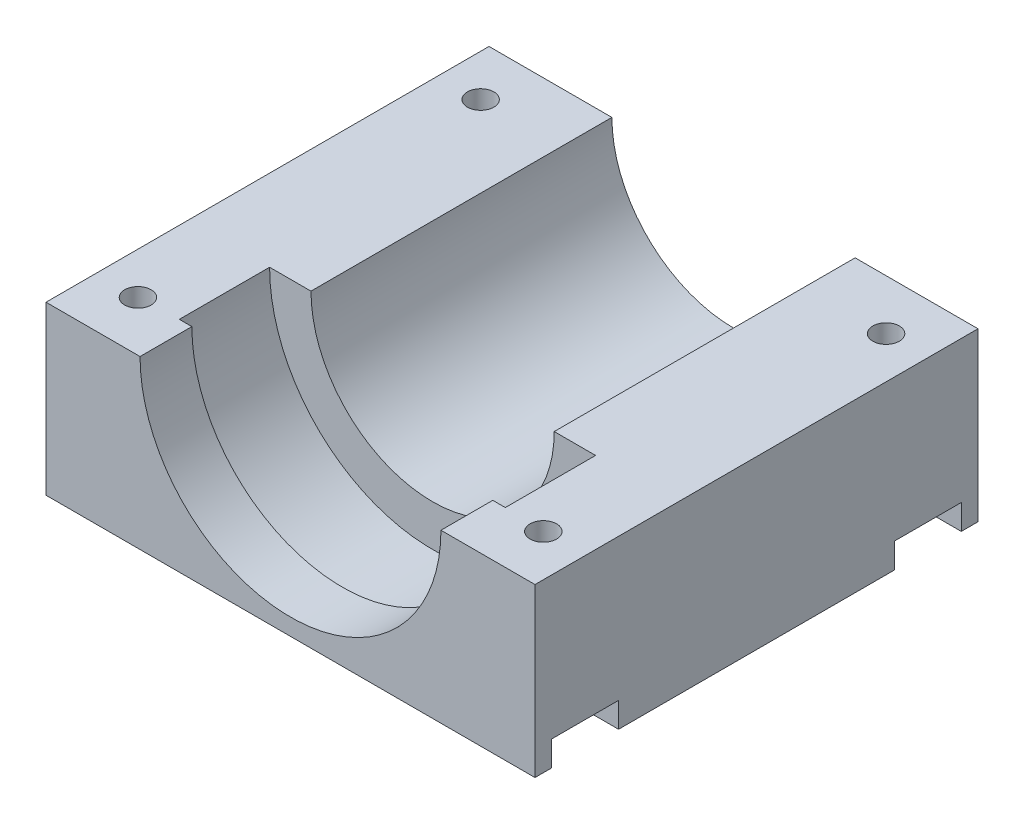
ISO-10303-21;
HEADER;
FILE_DESCRIPTION(('STEP AP214'),'2;1');
FILE_NAME('part.step','',(''),(''),'','','');
FILE_SCHEMA(('AUTOMOTIVE_DESIGN { 1 0 10303 214 1 1 1 1 }'));
ENDSEC;
DATA;
#1=APPLICATION_CONTEXT('core data for automotive mechanical design processes');
#2=APPLICATION_PROTOCOL_DEFINITION('international standard','automotive_design',2000,#1);
#3=PRODUCT_CONTEXT('',#1,'mechanical');
#4=PRODUCT('Part','Part','',(#3));
#5=PRODUCT_RELATED_PRODUCT_CATEGORY('part','',(#4));
#6=PRODUCT_DEFINITION_FORMATION('','',#4);
#7=PRODUCT_DEFINITION_CONTEXT('part definition',#1,'design');
#8=PRODUCT_DEFINITION('design','',#6,#7);
#9=PRODUCT_DEFINITION_SHAPE('','',#8);
#10=(LENGTH_UNIT() NAMED_UNIT(*) SI_UNIT(.MILLI.,.METRE.));
#11=(NAMED_UNIT(*) PLANE_ANGLE_UNIT() SI_UNIT($,.RADIAN.));
#12=(NAMED_UNIT(*) SI_UNIT($,.STERADIAN.) SOLID_ANGLE_UNIT());
#13=UNCERTAINTY_MEASURE_WITH_UNIT(LENGTH_MEASURE(1.E-05),#10,'distance_accuracy_value','');
#14=(GEOMETRIC_REPRESENTATION_CONTEXT(3) GLOBAL_UNCERTAINTY_ASSIGNED_CONTEXT((#13)) GLOBAL_UNIT_ASSIGNED_CONTEXT((#10,
#11,#12)) REPRESENTATION_CONTEXT('',''));
#15=CARTESIAN_POINT('',(0.,0.,0.));
#16=DIRECTION('',(0.,0.,1.));
#17=DIRECTION('',(1.,0.,0.));
#18=AXIS2_PLACEMENT_3D('',#15,#16,#17);
#19=CARTESIAN_POINT('',(4.99999999999999,78.8908045977011,47.));
#20=DIRECTION('',(0.,-1.,0.));
#21=DIRECTION('',(1.,0.,0.));
#22=AXIS2_PLACEMENT_3D('',#19,#20,#21);
#23=CYLINDRICAL_SURFACE('',#22,1.585);
#24=CARTESIAN_POINT('',(5.,6.39080459770115,47.));
#25=DIRECTION('',(0.,-1.,0.));
#26=DIRECTION('',(0.,0.,-1.));
#27=AXIS2_PLACEMENT_3D('',#24,#25,#26);
#28=CIRCLE('',#27,1.585);
#29=CARTESIAN_POINT('',(5.,6.39080459770115,45.415));
#30=VERTEX_POINT('',#29);
#31=EDGE_CURVE('E340',#30,#30,#28,.T.);
#32=ORIENTED_EDGE('',*,*,#31,.F.);
#33=EDGE_LOOP('',(#32));
#34=FACE_BOUND('',#33,.T.);
#35=CARTESIAN_POINT('',(5.,-10.6091954022988,47.));
#36=DIRECTION('',(0.,-1.,0.));
#37=DIRECTION('',(1.,0.,0.));
#38=AXIS2_PLACEMENT_3D('',#35,#36,#37);
#39=CIRCLE('',#38,1.585);
#40=CARTESIAN_POINT('',(6.585,-10.6091954022988,47.));
#41=VERTEX_POINT('',#40);
#42=EDGE_CURVE('E272',#41,#41,#39,.F.);
#43=ORIENTED_EDGE('',*,*,#42,.F.);
#44=EDGE_LOOP('',(#43));
#45=FACE_BOUND('',#44,.T.);
#46=ADVANCED_FACE('F49',(#34,#45),#23,.F.);
#47=CARTESIAN_POINT('',(0.,-13.6091954022989,53.));
#48=DIRECTION('',(0.,1.,0.));
#49=DIRECTION('',(-1.,0.,0.));
#50=AXIS2_PLACEMENT_3D('',#47,#48,#49);
#51=PLANE('',#50);
#52=DIRECTION('',(0.,0.,-1.));
#53=VECTOR('',#52,1.);
#54=CARTESIAN_POINT('',(0.,-13.6091954022989,53.));
#55=LINE('',#54,#53);
#56=CARTESIAN_POINT('',(0.,-13.6091954022989,53.));
#57=VERTEX_POINT('',#56);
#58=CARTESIAN_POINT('',(0.,-13.6091954022988,51.));
#59=VERTEX_POINT('',#58);
#60=EDGE_CURVE('E423',#57,#59,#55,.T.);
#61=ORIENTED_EDGE('',*,*,#60,.T.);
#62=DIRECTION('',(-1.,0.,0.));
#63=VECTOR('',#62,1.);
#64=CARTESIAN_POINT('',(0.,-13.6091954022988,51.));
#65=LINE('',#64,#63);
#66=CARTESIAN_POINT('',(10.,-13.6091954022988,51.));
#67=VERTEX_POINT('',#66);
#68=EDGE_CURVE('E259',#67,#59,#65,.T.);
#69=ORIENTED_EDGE('',*,*,#68,.F.);
#70=DIRECTION('',(0.,0.,1.));
#71=VECTOR('',#70,1.);
#72=CARTESIAN_POINT('',(10.,-13.6091954022988,51.));
#73=LINE('',#72,#71);
#74=CARTESIAN_POINT('',(10.,-13.6091954022988,43.));
#75=VERTEX_POINT('',#74);
#76=EDGE_CURVE('E251',#75,#67,#73,.T.);
#77=ORIENTED_EDGE('',*,*,#76,.F.);
#78=DIRECTION('',(1.,0.,0.));
#79=VECTOR('',#78,1.);
#80=CARTESIAN_POINT('',(0.,-13.6091954022988,43.));
#81=LINE('',#80,#79);
#82=CARTESIAN_POINT('',(0.,-13.6091954022988,43.));
#83=VERTEX_POINT('',#82);
#84=EDGE_CURVE('E248',#83,#75,#81,.T.);
#85=ORIENTED_EDGE('',*,*,#84,.F.);
#86=CARTESIAN_POINT('',(0.,-13.6091954022988,10.));
#87=VERTEX_POINT('',#86);
#88=EDGE_CURVE('E426',#83,#87,#55,.T.);
#89=ORIENTED_EDGE('',*,*,#88,.T.);
#90=DIRECTION('',(1.,0.,0.));
#91=VECTOR('',#90,1.);
#92=CARTESIAN_POINT('',(0.,-13.6091954022988,10.));
#93=LINE('',#92,#91);
#94=CARTESIAN_POINT('',(10.,-13.6091954022988,10.));
#95=VERTEX_POINT('',#94);
#96=EDGE_CURVE('E308',#87,#95,#93,.T.);
#97=ORIENTED_EDGE('',*,*,#96,.T.);
#98=DIRECTION('',(0.,0.,-1.));
#99=VECTOR('',#98,1.);
#100=CARTESIAN_POINT('',(10.,-13.6091954022988,2.));
#101=LINE('',#100,#99);
#102=CARTESIAN_POINT('',(10.,-13.6091954022988,2.));
#103=VERTEX_POINT('',#102);
#104=EDGE_CURVE('E318',#95,#103,#101,.T.);
#105=ORIENTED_EDGE('',*,*,#104,.T.);
#106=DIRECTION('',(-1.,0.,0.));
#107=VECTOR('',#106,1.);
#108=CARTESIAN_POINT('',(0.,-13.6091954022988,2.));
#109=LINE('',#108,#107);
#110=CARTESIAN_POINT('',(0.,-13.6091954022989,2.));
#111=VERTEX_POINT('',#110);
#112=EDGE_CURVE('E315',#103,#111,#109,.T.);
#113=ORIENTED_EDGE('',*,*,#112,.T.);
#114=CARTESIAN_POINT('',(0.,-13.6091954022989,0.));
#115=VERTEX_POINT('',#114);
#116=EDGE_CURVE('E421',#111,#115,#55,.T.);
#117=ORIENTED_EDGE('',*,*,#116,.T.);
#118=DIRECTION('',(1.,0.,0.));
#119=VECTOR('',#118,1.);
#120=CARTESIAN_POINT('',(0.,-13.6091954022989,0.));
#121=LINE('',#120,#119);
#122=CARTESIAN_POINT('',(58.5,-13.6091954022988,0.));
#123=VERTEX_POINT('',#122);
#124=EDGE_CURVE('E404',#115,#123,#121,.T.);
#125=ORIENTED_EDGE('',*,*,#124,.T.);
#126=DIRECTION('',(0.,0.,-1.));
#127=VECTOR('',#126,1.);
#128=CARTESIAN_POINT('',(58.5,-13.6091954022988,53.));
#129=LINE('',#128,#127);
#130=CARTESIAN_POINT('',(58.5,-13.6091954022988,2.));
#131=VERTEX_POINT('',#130);
#132=EDGE_CURVE('E417',#131,#123,#129,.T.);
#133=ORIENTED_EDGE('',*,*,#132,.F.);
#134=DIRECTION('',(1.,0.,0.));
#135=VECTOR('',#134,1.);
#136=CARTESIAN_POINT('',(58.5,-13.6091954022988,2.));
#137=LINE('',#136,#135);
#138=CARTESIAN_POINT('',(48.5,-13.6091954022988,2.));
#139=VERTEX_POINT('',#138);
#140=EDGE_CURVE('E348',#139,#131,#137,.T.);
#141=ORIENTED_EDGE('',*,*,#140,.F.);
#142=DIRECTION('',(0.,0.,-1.));
#143=VECTOR('',#142,1.);
#144=CARTESIAN_POINT('',(48.5,-13.6091954022988,2.));
#145=LINE('',#144,#143);
#146=CARTESIAN_POINT('',(48.5,-13.6091954022988,10.));
#147=VERTEX_POINT('',#146);
#148=EDGE_CURVE('E359',#147,#139,#145,.T.);
#149=ORIENTED_EDGE('',*,*,#148,.F.);
#150=DIRECTION('',(-1.,0.,0.));
#151=VECTOR('',#150,1.);
#152=CARTESIAN_POINT('',(58.5,-13.6091954022988,10.));
#153=LINE('',#152,#151);
#154=CARTESIAN_POINT('',(58.5,-13.6091954022988,10.));
#155=VERTEX_POINT('',#154);
#156=EDGE_CURVE('E343',#155,#147,#153,.T.);
#157=ORIENTED_EDGE('',*,*,#156,.F.);
#158=CARTESIAN_POINT('',(58.5,-13.6091954022988,43.));
#159=VERTEX_POINT('',#158);
#160=EDGE_CURVE('E422',#159,#155,#129,.T.);
#161=ORIENTED_EDGE('',*,*,#160,.F.);
#162=DIRECTION('',(-1.,0.,0.));
#163=VECTOR('',#162,1.);
#164=CARTESIAN_POINT('',(58.5,-13.6091954022988,43.));
#165=LINE('',#164,#163);
#166=CARTESIAN_POINT('',(48.5,-13.6091954022988,43.));
#167=VERTEX_POINT('',#166);
#168=EDGE_CURVE('E282',#159,#167,#165,.T.);
#169=ORIENTED_EDGE('',*,*,#168,.T.);
#170=DIRECTION('',(0.,0.,1.));
#171=VECTOR('',#170,1.);
#172=CARTESIAN_POINT('',(48.5,-13.6091954022988,51.));
#173=LINE('',#172,#171);
#174=CARTESIAN_POINT('',(48.5,-13.6091954022988,51.));
#175=VERTEX_POINT('',#174);
#176=EDGE_CURVE('E292',#167,#175,#173,.T.);
#177=ORIENTED_EDGE('',*,*,#176,.T.);
#178=DIRECTION('',(1.,0.,0.));
#179=VECTOR('',#178,1.);
#180=CARTESIAN_POINT('',(58.5,-13.6091954022988,51.));
#181=LINE('',#180,#179);
#182=CARTESIAN_POINT('',(58.5,-13.6091954022988,51.));
#183=VERTEX_POINT('',#182);
#184=EDGE_CURVE('E289',#175,#183,#181,.T.);
#185=ORIENTED_EDGE('',*,*,#184,.T.);
#186=CARTESIAN_POINT('',(58.5,-13.6091954022988,53.));
#187=VERTEX_POINT('',#186);
#188=EDGE_CURVE('E418',#187,#183,#129,.T.);
#189=ORIENTED_EDGE('',*,*,#188,.F.);
#190=DIRECTION('',(1.,0.,0.));
#191=VECTOR('',#190,1.);
#192=CARTESIAN_POINT('',(0.,-13.6091954022989,53.));
#193=LINE('',#192,#191);
#194=EDGE_CURVE('E392',#57,#187,#193,.T.);
#195=ORIENTED_EDGE('',*,*,#194,.F.);
#196=EDGE_LOOP('',(#61,#69,#77,#85,#89,#97,#105,#113,#117,#125,#133,#141,#149,#157,#161,#169,
#177,#185,#189,#195));
#197=FACE_BOUND('',#196,.T.);
#198=ADVANCED_FACE('F441',(#197),#51,.F.);
#199=CARTESIAN_POINT('',(58.5,-13.6091954022988,53.));
#200=DIRECTION('',(-1.,0.,0.));
#201=DIRECTION('',(0.,0.,1.));
#202=AXIS2_PLACEMENT_3D('',#199,#200,#201);
#203=PLANE('',#202);
#204=DIRECTION('',(0.,-1.,0.));
#205=VECTOR('',#204,1.);
#206=CARTESIAN_POINT('',(58.5,-10.6091954022988,43.));
#207=LINE('',#206,#205);
#208=CARTESIAN_POINT('',(58.5,-10.6091954022988,43.));
#209=VERTEX_POINT('',#208);
#210=EDGE_CURVE('E72',#209,#159,#207,.T.);
#211=ORIENTED_EDGE('',*,*,#210,.T.);
#212=ORIENTED_EDGE('',*,*,#160,.T.);
#213=DIRECTION('',(0.,-1.,0.));
#214=VECTOR('',#213,1.);
#215=CARTESIAN_POINT('',(58.5,-10.6091954022988,10.));
#216=LINE('',#215,#214);
#217=CARTESIAN_POINT('',(58.5,-10.6091954022988,10.));
#218=VERTEX_POINT('',#217);
#219=EDGE_CURVE('E356',#218,#155,#216,.T.);
#220=ORIENTED_EDGE('',*,*,#219,.F.);
#221=DIRECTION('',(0.,0.,1.));
#222=VECTOR('',#221,1.);
#223=CARTESIAN_POINT('',(58.5,-10.6091954022988,2.));
#224=LINE('',#223,#222);
#225=CARTESIAN_POINT('',(58.5,-10.6091954022988,2.));
#226=VERTEX_POINT('',#225);
#227=EDGE_CURVE('E344',#226,#218,#224,.T.);
#228=ORIENTED_EDGE('',*,*,#227,.F.);
#229=DIRECTION('',(0.,-1.,0.));
#230=VECTOR('',#229,1.);
#231=CARTESIAN_POINT('',(58.5,-10.6091954022988,2.));
#232=LINE('',#231,#230);
#233=EDGE_CURVE('E363',#226,#131,#232,.T.);
#234=ORIENTED_EDGE('',*,*,#233,.T.);
#235=ORIENTED_EDGE('',*,*,#132,.T.);
#236=DIRECTION('',(0.,1.,0.));
#237=VECTOR('',#236,1.);
#238=CARTESIAN_POINT('',(58.5,-13.6091954022988,0.));
#239=LINE('',#238,#237);
#240=CARTESIAN_POINT('',(58.5,6.39080459770115,0.));
#241=VERTEX_POINT('',#240);
#242=EDGE_CURVE('E407',#123,#241,#239,.T.);
#243=ORIENTED_EDGE('',*,*,#242,.T.);
#244=DIRECTION('',(0.,0.,-1.));
#245=VECTOR('',#244,1.);
#246=CARTESIAN_POINT('',(58.5,6.39080459770115,53.));
#247=LINE('',#246,#245);
#248=CARTESIAN_POINT('',(58.5,6.39080459770115,53.));
#249=VERTEX_POINT('',#248);
#250=EDGE_CURVE('E414',#249,#241,#247,.T.);
#251=ORIENTED_EDGE('',*,*,#250,.F.);
#252=DIRECTION('',(0.,1.,0.));
#253=VECTOR('',#252,1.);
#254=CARTESIAN_POINT('',(58.5,-13.6091954022988,53.));
#255=LINE('',#254,#253);
#256=EDGE_CURVE('E395',#187,#249,#255,.T.);
#257=ORIENTED_EDGE('',*,*,#256,.F.);
#258=ORIENTED_EDGE('',*,*,#188,.T.);
#259=DIRECTION('',(0.,-1.,0.));
#260=VECTOR('',#259,1.);
#261=CARTESIAN_POINT('',(58.5,-10.6091954022988,51.));
#262=LINE('',#261,#260);
#263=CARTESIAN_POINT('',(58.5,-10.6091954022988,51.));
#264=VERTEX_POINT('',#263);
#265=EDGE_CURVE('E288',#264,#183,#262,.T.);
#266=ORIENTED_EDGE('',*,*,#265,.F.);
#267=DIRECTION('',(0.,0.,-1.));
#268=VECTOR('',#267,1.);
#269=CARTESIAN_POINT('',(58.5,-10.6091954022988,51.));
#270=LINE('',#269,#268);
#271=EDGE_CURVE('E278',#264,#209,#270,.T.);
#272=ORIENTED_EDGE('',*,*,#271,.T.);
#273=EDGE_LOOP('',(#211,#212,#220,#228,#234,#235,#243,#251,#257,#258,#266,#272));
#274=FACE_BOUND('',#273,.T.);
#275=ADVANCED_FACE('F447',(#274),#203,.F.);
#276=CARTESIAN_POINT('',(53.5,78.8908045977011,47.));
#277=DIRECTION('',(0.,-1.,0.));
#278=DIRECTION('',(1.,0.,0.));
#279=AXIS2_PLACEMENT_3D('',#276,#277,#278);
#280=CYLINDRICAL_SURFACE('',#279,1.585);
#281=CARTESIAN_POINT('',(53.5,6.39080459770115,47.));
#282=DIRECTION('',(0.,-1.,0.));
#283=DIRECTION('',(0.,0.,-1.));
#284=AXIS2_PLACEMENT_3D('',#281,#282,#283);
#285=CIRCLE('',#284,1.585);
#286=CARTESIAN_POINT('',(53.5,6.39080459770115,45.415));
#287=VERTEX_POINT('',#286);
#288=EDGE_CURVE('E335',#287,#287,#285,.T.);
#289=ORIENTED_EDGE('',*,*,#288,.F.);
#290=EDGE_LOOP('',(#289));
#291=FACE_BOUND('',#290,.T.);
#292=CARTESIAN_POINT('',(53.5,-10.6091954022988,47.));
#293=DIRECTION('',(0.,-1.,0.));
#294=DIRECTION('',(1.,0.,0.));
#295=AXIS2_PLACEMENT_3D('',#292,#293,#294);
#296=CIRCLE('',#295,1.585);
#297=CARTESIAN_POINT('',(55.085,-10.6091954022988,47.));
#298=VERTEX_POINT('',#297);
#299=EDGE_CURVE('E298',#298,#298,#296,.F.);
#300=ORIENTED_EDGE('',*,*,#299,.F.);
#301=EDGE_LOOP('',(#300));
#302=FACE_BOUND('',#301,.T.);
#303=ADVANCED_FACE('F454',(#291,#302),#280,.F.);
#304=CARTESIAN_POINT('',(0.,-13.6091954022989,53.));
#305=DIRECTION('',(1.,0.,0.));
#306=DIRECTION('',(0.,0.,-1.));
#307=AXIS2_PLACEMENT_3D('',#304,#305,#306);
#308=PLANE('',#307);
#309=DIRECTION('',(0.,0.,-1.));
#310=VECTOR('',#309,1.);
#311=CARTESIAN_POINT('',(0.,-10.6091954022988,51.));
#312=LINE('',#311,#310);
#313=CARTESIAN_POINT('',(0.,-10.6091954022988,51.));
#314=VERTEX_POINT('',#313);
#315=CARTESIAN_POINT('',(0.,-10.6091954022988,43.));
#316=VERTEX_POINT('',#315);
#317=EDGE_CURVE('E256',#314,#316,#312,.T.);
#318=ORIENTED_EDGE('',*,*,#317,.F.);
#319=DIRECTION('',(0.,-1.,0.));
#320=VECTOR('',#319,1.);
#321=CARTESIAN_POINT('',(0.,-10.6091954022988,51.));
#322=LINE('',#321,#320);
#323=EDGE_CURVE('E269',#314,#59,#322,.T.);
#324=ORIENTED_EDGE('',*,*,#323,.T.);
#325=ORIENTED_EDGE('',*,*,#60,.F.);
#326=DIRECTION('',(0.,-1.,0.));
#327=VECTOR('',#326,1.);
#328=CARTESIAN_POINT('',(0.,-13.6091954022989,53.));
#329=LINE('',#328,#327);
#330=CARTESIAN_POINT('',(0.,6.39080459770115,53.));
#331=VERTEX_POINT('',#330);
#332=EDGE_CURVE('E389',#331,#57,#329,.T.);
#333=ORIENTED_EDGE('',*,*,#332,.F.);
#334=DIRECTION('',(0.,0.,-1.));
#335=VECTOR('',#334,1.);
#336=CARTESIAN_POINT('',(0.,6.39080459770115,53.));
#337=LINE('',#336,#335);
#338=CARTESIAN_POINT('',(0.,6.39080459770115,0.));
#339=VERTEX_POINT('',#338);
#340=EDGE_CURVE('E401',#331,#339,#337,.T.);
#341=ORIENTED_EDGE('',*,*,#340,.T.);
#342=DIRECTION('',(0.,-1.,0.));
#343=VECTOR('',#342,1.);
#344=CARTESIAN_POINT('',(0.,-13.6091954022989,0.));
#345=LINE('',#344,#343);
#346=EDGE_CURVE('E387',#339,#115,#345,.T.);
#347=ORIENTED_EDGE('',*,*,#346,.T.);
#348=ORIENTED_EDGE('',*,*,#116,.F.);
#349=DIRECTION('',(0.,-1.,0.));
#350=VECTOR('',#349,1.);
#351=CARTESIAN_POINT('',(0.,-10.6091954022988,2.));
#352=LINE('',#351,#350);
#353=CARTESIAN_POINT('',(0.,-10.6091954022988,2.));
#354=VERTEX_POINT('',#353);
#355=EDGE_CURVE('E314',#354,#111,#352,.T.);
#356=ORIENTED_EDGE('',*,*,#355,.F.);
#357=DIRECTION('',(0.,0.,1.));
#358=VECTOR('',#357,1.);
#359=CARTESIAN_POINT('',(0.,-10.6091954022988,2.));
#360=LINE('',#359,#358);
#361=CARTESIAN_POINT('',(0.,-10.6091954022988,10.));
#362=VERTEX_POINT('',#361);
#363=EDGE_CURVE('E304',#354,#362,#360,.T.);
#364=ORIENTED_EDGE('',*,*,#363,.T.);
#365=DIRECTION('',(0.,-1.,0.));
#366=VECTOR('',#365,1.);
#367=CARTESIAN_POINT('',(0.,-10.6091954022988,10.));
#368=LINE('',#367,#366);
#369=EDGE_CURVE('E323',#362,#87,#368,.T.);
#370=ORIENTED_EDGE('',*,*,#369,.T.);
#371=ORIENTED_EDGE('',*,*,#88,.F.);
#372=DIRECTION('',(0.,-1.,0.));
#373=VECTOR('',#372,1.);
#374=CARTESIAN_POINT('',(0.,-10.6091954022988,43.));
#375=LINE('',#374,#373);
#376=EDGE_CURVE('E264',#316,#83,#375,.T.);
#377=ORIENTED_EDGE('',*,*,#376,.F.);
#378=EDGE_LOOP('',(#318,#324,#325,#333,#341,#347,#348,#356,#364,#370,#371,#377));
#379=FACE_BOUND('',#378,.T.);
#380=ADVANCED_FACE('F51',(#379),#308,.F.);
#381=CARTESIAN_POINT('',(4.99999999999999,78.8908045977011,6.00000000000001));
#382=DIRECTION('',(0.,-1.,0.));
#383=DIRECTION('',(1.,0.,0.));
#384=AXIS2_PLACEMENT_3D('',#381,#382,#383);
#385=CYLINDRICAL_SURFACE('',#384,1.585);
#386=CARTESIAN_POINT('',(5.,6.39080459770115,6.00000000000001));
#387=DIRECTION('',(0.,-1.,0.));
#388=DIRECTION('',(0.,0.,-1.));
#389=AXIS2_PLACEMENT_3D('',#386,#387,#388);
#390=CIRCLE('',#389,1.585);
#391=CARTESIAN_POINT('',(5.,6.39080459770115,4.41500000000001));
#392=VERTEX_POINT('',#391);
#393=EDGE_CURVE('E337',#392,#392,#390,.T.);
#394=ORIENTED_EDGE('',*,*,#393,.F.);
#395=EDGE_LOOP('',(#394));
#396=FACE_BOUND('',#395,.T.);
#397=CARTESIAN_POINT('',(5.,-10.6091954022988,6.00000000000001));
#398=DIRECTION('',(0.,-1.,0.));
#399=DIRECTION('',(1.,0.,0.));
#400=AXIS2_PLACEMENT_3D('',#397,#398,#399);
#401=CIRCLE('',#400,1.585);
#402=CARTESIAN_POINT('',(6.585,-10.6091954022988,6.00000000000001));
#403=VERTEX_POINT('',#402);
#404=EDGE_CURVE('E326',#403,#403,#401,.F.);
#405=ORIENTED_EDGE('',*,*,#404,.F.);
#406=EDGE_LOOP('',(#405));
#407=FACE_BOUND('',#406,.T.);
#408=ADVANCED_FACE('F452',(#396,#407),#385,.F.);
#409=CARTESIAN_POINT('',(0.,6.39080459770115,53.));
#410=DIRECTION('',(0.,-1.,0.));
#411=DIRECTION('',(0.,0.,-1.));
#412=AXIS2_PLACEMENT_3D('',#409,#410,#411);
#413=PLANE('',#412);
#414=ORIENTED_EDGE('',*,*,#31,.T.);
#415=EDGE_LOOP('',(#414));
#416=FACE_BOUND('',#415,.T.);
#417=ORIENTED_EDGE('',*,*,#393,.T.);
#418=EDGE_LOOP('',(#417));
#419=FACE_BOUND('',#418,.T.);
#420=DIRECTION('',(0.,0.,1.));
#421=VECTOR('',#420,1.);
#422=CARTESIAN_POINT('',(11.25,6.39080459770115,36.));
#423=LINE('',#422,#421);
#424=CARTESIAN_POINT('',(11.25,6.39080459770115,46.8));
#425=VERTEX_POINT('',#424);
#426=CARTESIAN_POINT('',(11.25,6.39080459770115,53.));
#427=VERTEX_POINT('',#426);
#428=EDGE_CURVE('E385',#425,#427,#423,.T.);
#429=ORIENTED_EDGE('',*,*,#428,.F.);
#430=DIRECTION('',(-1.,0.,0.));
#431=VECTOR('',#430,1.);
#432=CARTESIAN_POINT('',(9.75,6.39080459770115,46.8));
#433=LINE('',#432,#431);
#434=CARTESIAN_POINT('',(9.75,6.39080459770115,46.8));
#435=VERTEX_POINT('',#434);
#436=EDGE_CURVE('E233',#425,#435,#433,.T.);
#437=ORIENTED_EDGE('',*,*,#436,.T.);
#438=DIRECTION('',(0.,0.,-1.));
#439=VECTOR('',#438,1.);
#440=CARTESIAN_POINT('',(9.75,6.39080459770115,46.8));
#441=LINE('',#440,#439);
#442=CARTESIAN_POINT('',(9.75,6.39080459770115,36.));
#443=VERTEX_POINT('',#442);
#444=EDGE_CURVE('E232',#435,#443,#441,.T.);
#445=ORIENTED_EDGE('',*,*,#444,.T.);
#446=DIRECTION('',(-1.,0.,0.));
#447=VECTOR('',#446,1.);
#448=CARTESIAN_POINT('',(11.25,6.39080459770115,36.));
#449=LINE('',#448,#447);
#450=CARTESIAN_POINT('',(14.7,6.39080459770115,36.));
#451=VERTEX_POINT('',#450);
#452=EDGE_CURVE('E382',#451,#443,#449,.T.);
#453=ORIENTED_EDGE('',*,*,#452,.F.);
#454=DIRECTION('',(0.,0.,-1.));
#455=VECTOR('',#454,1.);
#456=CARTESIAN_POINT('',(14.7,6.39080459770115,42.5));
#457=LINE('',#456,#455);
#458=CARTESIAN_POINT('',(14.7,6.39080459770115,0.));
#459=VERTEX_POINT('',#458);
#460=EDGE_CURVE('E374',#451,#459,#457,.T.);
#461=ORIENTED_EDGE('',*,*,#460,.T.);
#462=DIRECTION('',(-1.,0.,0.));
#463=VECTOR('',#462,1.);
#464=CARTESIAN_POINT('',(0.,6.39080459770115,0.));
#465=LINE('',#464,#463);
#466=EDGE_CURVE('E409',#459,#339,#465,.T.);
#467=ORIENTED_EDGE('',*,*,#466,.T.);
#468=ORIENTED_EDGE('',*,*,#340,.F.);
#469=DIRECTION('',(-1.,0.,0.));
#470=VECTOR('',#469,1.);
#471=CARTESIAN_POINT('',(0.,6.39080459770115,53.));
#472=LINE('',#471,#470);
#473=EDGE_CURVE('E397',#427,#331,#472,.T.);
#474=ORIENTED_EDGE('',*,*,#473,.F.);
#475=EDGE_LOOP('',(#429,#437,#445,#453,#461,#467,#468,#474));
#476=FACE_BOUND('',#475,.T.);
#477=ADVANCED_FACE('F497',(#416,#419,#476),#413,.F.);
#478=CARTESIAN_POINT('',(53.5,6.39080459770115,6.));
#479=DIRECTION('',(0.,-1.,0.));
#480=DIRECTION('',(0.,0.,-1.));
#481=AXIS2_PLACEMENT_3D('',#478,#479,#480);
#482=CIRCLE('',#481,1.585);
#483=CARTESIAN_POINT('',(53.5,6.39080459770115,4.415));
#484=VERTEX_POINT('',#483);
#485=EDGE_CURVE('E332',#484,#484,#482,.T.);
#486=ORIENTED_EDGE('',*,*,#485,.T.);
#487=EDGE_LOOP('',(#486));
#488=FACE_BOUND('',#487,.T.);
#489=ORIENTED_EDGE('',*,*,#288,.T.);
#490=EDGE_LOOP('',(#489));
#491=FACE_BOUND('',#490,.T.);
#492=DIRECTION('',(0.,0.,-1.));
#493=VECTOR('',#492,1.);
#494=CARTESIAN_POINT('',(48.75,6.39080459770115,46.8));
#495=LINE('',#494,#493);
#496=CARTESIAN_POINT('',(48.75,6.39080459770115,46.8));
#497=VERTEX_POINT('',#496);
#498=CARTESIAN_POINT('',(48.75,6.39080459770115,36.));
#499=VERTEX_POINT('',#498);
#500=EDGE_CURVE('E239',#497,#499,#495,.T.);
#501=ORIENTED_EDGE('',*,*,#500,.F.);
#502=CARTESIAN_POINT('',(47.25,6.39080459770115,46.8));
#503=VERTEX_POINT('',#502);
#504=EDGE_CURVE('E224',#497,#503,#433,.T.);
#505=ORIENTED_EDGE('',*,*,#504,.T.);
#506=DIRECTION('',(0.,0.,1.));
#507=VECTOR('',#506,1.);
#508=CARTESIAN_POINT('',(47.25,6.39080459770115,36.));
#509=LINE('',#508,#507);
#510=CARTESIAN_POINT('',(47.25,6.39080459770115,53.));
#511=VERTEX_POINT('',#510);
#512=EDGE_CURVE('E381',#503,#511,#509,.T.);
#513=ORIENTED_EDGE('',*,*,#512,.T.);
#514=EDGE_CURVE('E398',#249,#511,#472,.T.);
#515=ORIENTED_EDGE('',*,*,#514,.F.);
#516=ORIENTED_EDGE('',*,*,#250,.T.);
#517=CARTESIAN_POINT('',(43.8,6.39080459770115,0.));
#518=VERTEX_POINT('',#517);
#519=EDGE_CURVE('E393',#241,#518,#465,.T.);
#520=ORIENTED_EDGE('',*,*,#519,.T.);
#521=DIRECTION('',(0.,0.,-1.));
#522=VECTOR('',#521,1.);
#523=CARTESIAN_POINT('',(43.8,6.39080459770115,42.5));
#524=LINE('',#523,#522);
#525=CARTESIAN_POINT('',(43.8,6.39080459770115,36.));
#526=VERTEX_POINT('',#525);
#527=EDGE_CURVE('E375',#526,#518,#524,.T.);
#528=ORIENTED_EDGE('',*,*,#527,.F.);
#529=EDGE_CURVE('E247',#499,#526,#449,.T.);
#530=ORIENTED_EDGE('',*,*,#529,.F.);
#531=EDGE_LOOP('',(#501,#505,#513,#515,#516,#520,#528,#530));
#532=FACE_BOUND('',#531,.T.);
#533=ADVANCED_FACE('F244',(#488,#491,#532),#413,.F.);
#534=CARTESIAN_POINT('',(0.,0.,53.));
#535=DIRECTION('',(0.,0.,-1.));
#536=DIRECTION('',(-1.,0.,0.));
#537=AXIS2_PLACEMENT_3D('',#534,#535,#536);
#538=PLANE('',#537);
#539=ORIENTED_EDGE('',*,*,#514,.T.);
#540=CARTESIAN_POINT('',(29.25,6.39080459770116,53.));
#541=DIRECTION('',(0.,0.,1.));
#542=DIRECTION('',(1.,0.,0.));
#543=AXIS2_PLACEMENT_3D('',#540,#541,#542);
#544=CIRCLE('',#543,18.);
#545=EDGE_CURVE('E377',#427,#511,#544,.T.);
#546=ORIENTED_EDGE('',*,*,#545,.F.);
#547=ORIENTED_EDGE('',*,*,#473,.T.);
#548=ORIENTED_EDGE('',*,*,#332,.T.);
#549=ORIENTED_EDGE('',*,*,#194,.T.);
#550=ORIENTED_EDGE('',*,*,#256,.T.);
#551=EDGE_LOOP('',(#539,#546,#547,#548,#549,#550));
#552=FACE_BOUND('',#551,.T.);
#553=ADVANCED_FACE('F488',(#552),#538,.F.);
#554=CARTESIAN_POINT('',(0.,0.,0.));
#555=DIRECTION('',(0.,0.,-1.));
#556=DIRECTION('',(-1.,0.,0.));
#557=AXIS2_PLACEMENT_3D('',#554,#555,#556);
#558=PLANE('',#557);
#559=CARTESIAN_POINT('',(29.25,6.39080459770116,0.));
#560=DIRECTION('',(0.,0.,-1.));
#561=DIRECTION('',(-1.,0.,0.));
#562=AXIS2_PLACEMENT_3D('',#559,#560,#561);
#563=CIRCLE('',#562,14.55);
#564=EDGE_CURVE('E366',#518,#459,#563,.T.);
#565=ORIENTED_EDGE('',*,*,#564,.F.);
#566=ORIENTED_EDGE('',*,*,#519,.F.);
#567=ORIENTED_EDGE('',*,*,#242,.F.);
#568=ORIENTED_EDGE('',*,*,#124,.F.);
#569=ORIENTED_EDGE('',*,*,#346,.F.);
#570=ORIENTED_EDGE('',*,*,#466,.F.);
#571=EDGE_LOOP('',(#565,#566,#567,#568,#569,#570));
#572=FACE_BOUND('',#571,.T.);
#573=ADVANCED_FACE('F486',(#572),#558,.T.);
#574=CARTESIAN_POINT('',(29.25,6.39080459770116,36.));
#575=DIRECTION('',(0.,0.,1.));
#576=DIRECTION('',(1.,0.,0.));
#577=AXIS2_PLACEMENT_3D('',#574,#575,#576);
#578=CYLINDRICAL_SURFACE('',#577,18.);
#579=ORIENTED_EDGE('',*,*,#512,.F.);
#580=CARTESIAN_POINT('',(29.25,6.39080459770116,46.8));
#581=DIRECTION('',(0.,0.,1.));
#582=DIRECTION('',(1.,0.,0.));
#583=AXIS2_PLACEMENT_3D('',#580,#581,#582);
#584=CIRCLE('',#583,18.);
#585=EDGE_CURVE('E13',#503,#425,#584,.F.);
#586=ORIENTED_EDGE('',*,*,#585,.T.);
#587=ORIENTED_EDGE('',*,*,#428,.T.);
#588=ORIENTED_EDGE('',*,*,#545,.T.);
#589=EDGE_LOOP('',(#579,#586,#587,#588));
#590=FACE_BOUND('',#589,.T.);
#591=ADVANCED_FACE('F482',(#590),#578,.F.);
#592=CARTESIAN_POINT('',(29.25,6.39080459770116,36.));
#593=DIRECTION('',(0.,0.,1.));
#594=DIRECTION('',(1.,0.,0.));
#595=AXIS2_PLACEMENT_3D('',#592,#593,#594);
#596=PLANE('',#595);
#597=CARTESIAN_POINT('',(29.25,6.39080459770116,36.));
#598=DIRECTION('',(0.,0.,1.));
#599=DIRECTION('',(1.,0.,0.));
#600=AXIS2_PLACEMENT_3D('',#597,#598,#599);
#601=CIRCLE('',#600,14.55);
#602=EDGE_CURVE('E57',#451,#526,#601,.T.);
#603=ORIENTED_EDGE('',*,*,#602,.F.);
#604=ORIENTED_EDGE('',*,*,#452,.T.);
#605=CARTESIAN_POINT('',(29.25,6.39080459770115,36.));
#606=DIRECTION('',(0.,0.,1.));
#607=DIRECTION('',(1.,0.,0.));
#608=AXIS2_PLACEMENT_3D('',#605,#606,#607);
#609=CIRCLE('',#608,19.5);
#610=EDGE_CURVE('E242',#443,#499,#609,.T.);
#611=ORIENTED_EDGE('',*,*,#610,.T.);
#612=ORIENTED_EDGE('',*,*,#529,.T.);
#613=EDGE_LOOP('',(#603,#604,#611,#612));
#614=FACE_BOUND('',#613,.T.);
#615=ADVANCED_FACE('F478',(#614),#596,.T.);
#616=CARTESIAN_POINT('',(29.25,6.39080459770116,42.5));
#617=DIRECTION('',(0.,0.,-1.));
#618=DIRECTION('',(-1.,0.,0.));
#619=AXIS2_PLACEMENT_3D('',#616,#617,#618);
#620=CYLINDRICAL_SURFACE('',#619,14.55);
#621=ORIENTED_EDGE('',*,*,#602,.T.);
#622=ORIENTED_EDGE('',*,*,#527,.T.);
#623=ORIENTED_EDGE('',*,*,#564,.T.);
#624=ORIENTED_EDGE('',*,*,#460,.F.);
#625=EDGE_LOOP('',(#621,#622,#623,#624));
#626=FACE_BOUND('',#625,.T.);
#627=ADVANCED_FACE('F468',(#626),#620,.F.);
#628=CARTESIAN_POINT('',(58.5,-10.6091954022988,2.));
#629=DIRECTION('',(0.,0.,-1.));
#630=DIRECTION('',(-1.,0.,0.));
#631=AXIS2_PLACEMENT_3D('',#628,#629,#630);
#632=PLANE('',#631);
#633=ORIENTED_EDGE('',*,*,#140,.T.);
#634=ORIENTED_EDGE('',*,*,#233,.F.);
#635=DIRECTION('',(1.,0.,0.));
#636=VECTOR('',#635,1.);
#637=CARTESIAN_POINT('',(58.5,-10.6091954022988,2.));
#638=LINE('',#637,#636);
#639=CARTESIAN_POINT('',(48.5,-10.6091954022988,2.));
#640=VERTEX_POINT('',#639);
#641=EDGE_CURVE('E354',#640,#226,#638,.T.);
#642=ORIENTED_EDGE('',*,*,#641,.F.);
#643=DIRECTION('',(0.,-1.,0.));
#644=VECTOR('',#643,1.);
#645=CARTESIAN_POINT('',(48.5,-10.6091954022988,2.));
#646=LINE('',#645,#644);
#647=EDGE_CURVE('E367',#640,#139,#646,.T.);
#648=ORIENTED_EDGE('',*,*,#647,.T.);
#649=EDGE_LOOP('',(#633,#634,#642,#648));
#650=FACE_BOUND('',#649,.T.);
#651=ADVANCED_FACE('F464',(#650),#632,.F.);
#652=CARTESIAN_POINT('',(48.5,-10.6091954022988,2.));
#653=DIRECTION('',(-1.,0.,0.));
#654=DIRECTION('',(0.,-1.,0.));
#655=AXIS2_PLACEMENT_3D('',#652,#653,#654);
#656=PLANE('',#655);
#657=ORIENTED_EDGE('',*,*,#148,.T.);
#658=ORIENTED_EDGE('',*,*,#647,.F.);
#659=DIRECTION('',(0.,0.,-1.));
#660=VECTOR('',#659,1.);
#661=CARTESIAN_POINT('',(48.5,-10.6091954022988,2.));
#662=LINE('',#661,#660);
#663=CARTESIAN_POINT('',(48.5,-10.6091954022988,10.));
#664=VERTEX_POINT('',#663);
#665=EDGE_CURVE('E351',#664,#640,#662,.T.);
#666=ORIENTED_EDGE('',*,*,#665,.F.);
#667=DIRECTION('',(0.,-1.,0.));
#668=VECTOR('',#667,1.);
#669=CARTESIAN_POINT('',(48.5,-10.6091954022988,10.));
#670=LINE('',#669,#668);
#671=EDGE_CURVE('E369',#664,#147,#670,.T.);
#672=ORIENTED_EDGE('',*,*,#671,.T.);
#673=EDGE_LOOP('',(#657,#658,#666,#672));
#674=FACE_BOUND('',#673,.T.);
#675=ADVANCED_FACE('F467',(#674),#656,.F.);
#676=CARTESIAN_POINT('',(58.5,-10.6091954022988,10.));
#677=DIRECTION('',(0.,0.,1.));
#678=DIRECTION('',(1.,0.,0.));
#679=AXIS2_PLACEMENT_3D('',#676,#677,#678);
#680=PLANE('',#679);
#681=ORIENTED_EDGE('',*,*,#156,.T.);
#682=ORIENTED_EDGE('',*,*,#671,.F.);
#683=DIRECTION('',(-1.,0.,0.));
#684=VECTOR('',#683,1.);
#685=CARTESIAN_POINT('',(58.5,-10.6091954022988,10.));
#686=LINE('',#685,#684);
#687=EDGE_CURVE('E347',#218,#664,#686,.T.);
#688=ORIENTED_EDGE('',*,*,#687,.F.);
#689=ORIENTED_EDGE('',*,*,#219,.T.);
#690=EDGE_LOOP('',(#681,#682,#688,#689));
#691=FACE_BOUND('',#690,.T.);
#692=ADVANCED_FACE('F462',(#691),#680,.F.);
#693=CARTESIAN_POINT('',(0.,-10.6091954022989,0.));
#694=DIRECTION('',(0.,-1.,0.));
#695=DIRECTION('',(1.,0.,0.));
#696=AXIS2_PLACEMENT_3D('',#693,#694,#695);
#697=PLANE('',#696);
#698=CARTESIAN_POINT('',(53.5,-10.6091954022988,6.));
#699=DIRECTION('',(0.,-1.,0.));
#700=DIRECTION('',(1.,0.,0.));
#701=AXIS2_PLACEMENT_3D('',#698,#699,#700);
#702=CIRCLE('',#701,1.585);
#703=CARTESIAN_POINT('',(55.085,-10.6091954022988,6.));
#704=VERTEX_POINT('',#703);
#705=EDGE_CURVE('E336',#704,#704,#702,.T.);
#706=ORIENTED_EDGE('',*,*,#705,.F.);
#707=EDGE_LOOP('',(#706));
#708=FACE_BOUND('',#707,.T.);
#709=ORIENTED_EDGE('',*,*,#227,.T.);
#710=ORIENTED_EDGE('',*,*,#687,.T.);
#711=ORIENTED_EDGE('',*,*,#665,.T.);
#712=ORIENTED_EDGE('',*,*,#641,.T.);
#713=EDGE_LOOP('',(#709,#710,#711,#712));
#714=FACE_BOUND('',#713,.T.);
#715=ADVANCED_FACE('F458',(#708,#714),#697,.T.);
#716=CARTESIAN_POINT('',(53.5,78.8908045977011,6.));
#717=DIRECTION('',(0.,-1.,0.));
#718=DIRECTION('',(1.,0.,0.));
#719=AXIS2_PLACEMENT_3D('',#716,#717,#718);
#720=CYLINDRICAL_SURFACE('',#719,1.585);
#721=ORIENTED_EDGE('',*,*,#705,.T.);
#722=EDGE_LOOP('',(#721));
#723=FACE_BOUND('',#722,.T.);
#724=ORIENTED_EDGE('',*,*,#485,.F.);
#725=EDGE_LOOP('',(#724));
#726=FACE_BOUND('',#725,.T.);
#727=ADVANCED_FACE('F461',(#723,#726),#720,.F.);
#728=CARTESIAN_POINT('',(58.5,-10.6091954022989,0.));
#729=DIRECTION('',(0.,-1.,0.));
#730=DIRECTION('',(-1.,0.,0.));
#731=AXIS2_PLACEMENT_3D('',#728,#729,#730);
#732=PLANE('',#731);
#733=ORIENTED_EDGE('',*,*,#363,.F.);
#734=DIRECTION('',(-1.,0.,0.));
#735=VECTOR('',#734,1.);
#736=CARTESIAN_POINT('',(0.,-10.6091954022988,2.));
#737=LINE('',#736,#735);
#738=CARTESIAN_POINT('',(10.,-10.6091954022988,2.));
#739=VERTEX_POINT('',#738);
#740=EDGE_CURVE('E307',#739,#354,#737,.T.);
#741=ORIENTED_EDGE('',*,*,#740,.F.);
#742=DIRECTION('',(0.,0.,-1.));
#743=VECTOR('',#742,1.);
#744=CARTESIAN_POINT('',(10.,-10.6091954022988,2.));
#745=LINE('',#744,#743);
#746=CARTESIAN_POINT('',(10.,-10.6091954022988,10.));
#747=VERTEX_POINT('',#746);
#748=EDGE_CURVE('E310',#747,#739,#745,.T.);
#749=ORIENTED_EDGE('',*,*,#748,.F.);
#750=DIRECTION('',(1.,0.,0.));
#751=VECTOR('',#750,1.);
#752=CARTESIAN_POINT('',(0.,-10.6091954022988,10.));
#753=LINE('',#752,#751);
#754=EDGE_CURVE('E312',#362,#747,#753,.T.);
#755=ORIENTED_EDGE('',*,*,#754,.F.);
#756=EDGE_LOOP('',(#733,#741,#749,#755));
#757=FACE_BOUND('',#756,.T.);
#758=ORIENTED_EDGE('',*,*,#404,.T.);
#759=EDGE_LOOP('',(#758));
#760=FACE_BOUND('',#759,.T.);
#761=ADVANCED_FACE('F551',(#757,#760),#732,.T.);
#762=CARTESIAN_POINT('',(0.,-10.6091954022988,10.));
#763=DIRECTION('',(0.,0.,-1.));
#764=DIRECTION('',(-1.,0.,0.));
#765=AXIS2_PLACEMENT_3D('',#762,#763,#764);
#766=PLANE('',#765);
#767=ORIENTED_EDGE('',*,*,#96,.F.);
#768=ORIENTED_EDGE('',*,*,#369,.F.);
#769=ORIENTED_EDGE('',*,*,#754,.T.);
#770=DIRECTION('',(0.,-1.,0.));
#771=VECTOR('',#770,1.);
#772=CARTESIAN_POINT('',(10.,-10.6091954022988,10.));
#773=LINE('',#772,#771);
#774=EDGE_CURVE('E327',#747,#95,#773,.T.);
#775=ORIENTED_EDGE('',*,*,#774,.T.);
#776=EDGE_LOOP('',(#767,#768,#769,#775));
#777=FACE_BOUND('',#776,.T.);
#778=ADVANCED_FACE('F554',(#777),#766,.T.);
#779=CARTESIAN_POINT('',(10.,-10.6091954022988,2.));
#780=DIRECTION('',(-1.,0.,0.));
#781=DIRECTION('',(0.,-1.,0.));
#782=AXIS2_PLACEMENT_3D('',#779,#780,#781);
#783=PLANE('',#782);
#784=ORIENTED_EDGE('',*,*,#104,.F.);
#785=ORIENTED_EDGE('',*,*,#774,.F.);
#786=ORIENTED_EDGE('',*,*,#748,.T.);
#787=DIRECTION('',(0.,-1.,0.));
#788=VECTOR('',#787,1.);
#789=CARTESIAN_POINT('',(10.,-10.6091954022988,2.));
#790=LINE('',#789,#788);
#791=EDGE_CURVE('E329',#739,#103,#790,.T.);
#792=ORIENTED_EDGE('',*,*,#791,.T.);
#793=EDGE_LOOP('',(#784,#785,#786,#792));
#794=FACE_BOUND('',#793,.T.);
#795=ADVANCED_FACE('F558',(#794),#783,.T.);
#796=CARTESIAN_POINT('',(0.,-10.6091954022988,2.));
#797=DIRECTION('',(0.,0.,1.));
#798=DIRECTION('',(1.,0.,0.));
#799=AXIS2_PLACEMENT_3D('',#796,#797,#798);
#800=PLANE('',#799);
#801=ORIENTED_EDGE('',*,*,#112,.F.);
#802=ORIENTED_EDGE('',*,*,#791,.F.);
#803=ORIENTED_EDGE('',*,*,#740,.T.);
#804=ORIENTED_EDGE('',*,*,#355,.T.);
#805=EDGE_LOOP('',(#801,#802,#803,#804));
#806=FACE_BOUND('',#805,.T.);
#807=ADVANCED_FACE('F562',(#806),#800,.T.);
#808=CARTESIAN_POINT('',(0.,-10.6091954022989,53.));
#809=DIRECTION('',(0.,-1.,0.));
#810=DIRECTION('',(1.,0.,0.));
#811=AXIS2_PLACEMENT_3D('',#808,#809,#810);
#812=PLANE('',#811);
#813=ORIENTED_EDGE('',*,*,#271,.F.);
#814=DIRECTION('',(1.,0.,0.));
#815=VECTOR('',#814,1.);
#816=CARTESIAN_POINT('',(58.5,-10.6091954022988,51.));
#817=LINE('',#816,#815);
#818=CARTESIAN_POINT('',(48.5,-10.6091954022988,51.));
#819=VERTEX_POINT('',#818);
#820=EDGE_CURVE('E281',#819,#264,#817,.T.);
#821=ORIENTED_EDGE('',*,*,#820,.F.);
#822=DIRECTION('',(0.,0.,1.));
#823=VECTOR('',#822,1.);
#824=CARTESIAN_POINT('',(48.5,-10.6091954022988,51.));
#825=LINE('',#824,#823);
#826=CARTESIAN_POINT('',(48.5,-10.6091954022988,43.));
#827=VERTEX_POINT('',#826);
#828=EDGE_CURVE('E284',#827,#819,#825,.T.);
#829=ORIENTED_EDGE('',*,*,#828,.F.);
#830=DIRECTION('',(-1.,0.,0.));
#831=VECTOR('',#830,1.);
#832=CARTESIAN_POINT('',(58.5,-10.6091954022988,43.));
#833=LINE('',#832,#831);
#834=EDGE_CURVE('E286',#209,#827,#833,.T.);
#835=ORIENTED_EDGE('',*,*,#834,.F.);
#836=EDGE_LOOP('',(#813,#821,#829,#835));
#837=FACE_BOUND('',#836,.T.);
#838=ORIENTED_EDGE('',*,*,#299,.T.);
#839=EDGE_LOOP('',(#838));
#840=FACE_BOUND('',#839,.T.);
#841=ADVANCED_FACE('F535',(#837,#840),#812,.T.);
#842=CARTESIAN_POINT('',(58.5,-10.6091954022988,43.));
#843=DIRECTION('',(0.,0.,1.));
#844=DIRECTION('',(1.,0.,0.));
#845=AXIS2_PLACEMENT_3D('',#842,#843,#844);
#846=PLANE('',#845);
#847=ORIENTED_EDGE('',*,*,#168,.F.);
#848=ORIENTED_EDGE('',*,*,#210,.F.);
#849=ORIENTED_EDGE('',*,*,#834,.T.);
#850=DIRECTION('',(0.,-1.,0.));
#851=VECTOR('',#850,1.);
#852=CARTESIAN_POINT('',(48.5,-10.6091954022988,43.));
#853=LINE('',#852,#851);
#854=EDGE_CURVE('E299',#827,#167,#853,.T.);
#855=ORIENTED_EDGE('',*,*,#854,.T.);
#856=EDGE_LOOP('',(#847,#848,#849,#855));
#857=FACE_BOUND('',#856,.T.);
#858=ADVANCED_FACE('F538',(#857),#846,.T.);
#859=CARTESIAN_POINT('',(48.5,-10.6091954022988,51.));
#860=DIRECTION('',(1.,0.,0.));
#861=DIRECTION('',(0.,1.,0.));
#862=AXIS2_PLACEMENT_3D('',#859,#860,#861);
#863=PLANE('',#862);
#864=ORIENTED_EDGE('',*,*,#176,.F.);
#865=ORIENTED_EDGE('',*,*,#854,.F.);
#866=ORIENTED_EDGE('',*,*,#828,.T.);
#867=DIRECTION('',(0.,-1.,0.));
#868=VECTOR('',#867,1.);
#869=CARTESIAN_POINT('',(48.5,-10.6091954022988,51.));
#870=LINE('',#869,#868);
#871=EDGE_CURVE('E301',#819,#175,#870,.T.);
#872=ORIENTED_EDGE('',*,*,#871,.T.);
#873=EDGE_LOOP('',(#864,#865,#866,#872));
#874=FACE_BOUND('',#873,.T.);
#875=ADVANCED_FACE('F540',(#874),#863,.T.);
#876=CARTESIAN_POINT('',(58.5,-10.6091954022988,51.));
#877=DIRECTION('',(0.,0.,-1.));
#878=DIRECTION('',(-1.,0.,0.));
#879=AXIS2_PLACEMENT_3D('',#876,#877,#878);
#880=PLANE('',#879);
#881=ORIENTED_EDGE('',*,*,#184,.F.);
#882=ORIENTED_EDGE('',*,*,#871,.F.);
#883=ORIENTED_EDGE('',*,*,#820,.T.);
#884=ORIENTED_EDGE('',*,*,#265,.T.);
#885=EDGE_LOOP('',(#881,#882,#883,#884));
#886=FACE_BOUND('',#885,.T.);
#887=ADVANCED_FACE('F531',(#886),#880,.T.);
#888=CARTESIAN_POINT('',(58.5,-10.6091954022989,53.));
#889=DIRECTION('',(0.,-1.,0.));
#890=DIRECTION('',(-1.,0.,0.));
#891=AXIS2_PLACEMENT_3D('',#888,#889,#890);
#892=PLANE('',#891);
#893=ORIENTED_EDGE('',*,*,#317,.T.);
#894=DIRECTION('',(1.,0.,0.));
#895=VECTOR('',#894,1.);
#896=CARTESIAN_POINT('',(0.,-10.6091954022988,43.));
#897=LINE('',#896,#895);
#898=CARTESIAN_POINT('',(10.,-10.6091954022988,43.));
#899=VERTEX_POINT('',#898);
#900=EDGE_CURVE('E258',#316,#899,#897,.T.);
#901=ORIENTED_EDGE('',*,*,#900,.T.);
#902=DIRECTION('',(0.,0.,1.));
#903=VECTOR('',#902,1.);
#904=CARTESIAN_POINT('',(10.,-10.6091954022988,51.));
#905=LINE('',#904,#903);
#906=CARTESIAN_POINT('',(10.,-10.6091954022988,51.));
#907=VERTEX_POINT('',#906);
#908=EDGE_CURVE('E262',#899,#907,#905,.T.);
#909=ORIENTED_EDGE('',*,*,#908,.T.);
#910=DIRECTION('',(-1.,0.,0.));
#911=VECTOR('',#910,1.);
#912=CARTESIAN_POINT('',(0.,-10.6091954022988,51.));
#913=LINE('',#912,#911);
#914=EDGE_CURVE('E64',#907,#314,#913,.T.);
#915=ORIENTED_EDGE('',*,*,#914,.T.);
#916=EDGE_LOOP('',(#893,#901,#909,#915));
#917=FACE_BOUND('',#916,.T.);
#918=ORIENTED_EDGE('',*,*,#42,.T.);
#919=EDGE_LOOP('',(#918));
#920=FACE_BOUND('',#919,.T.);
#921=ADVANCED_FACE('F438',(#917,#920),#892,.T.);
#922=CARTESIAN_POINT('',(0.,-10.6091954022988,51.));
#923=DIRECTION('',(0.,0.,1.));
#924=DIRECTION('',(1.,0.,0.));
#925=AXIS2_PLACEMENT_3D('',#922,#923,#924);
#926=PLANE('',#925);
#927=ORIENTED_EDGE('',*,*,#68,.T.);
#928=ORIENTED_EDGE('',*,*,#323,.F.);
#929=ORIENTED_EDGE('',*,*,#914,.F.);
#930=DIRECTION('',(0.,-1.,0.));
#931=VECTOR('',#930,1.);
#932=CARTESIAN_POINT('',(10.,-10.6091954022988,51.));
#933=LINE('',#932,#931);
#934=EDGE_CURVE('E273',#907,#67,#933,.T.);
#935=ORIENTED_EDGE('',*,*,#934,.T.);
#936=EDGE_LOOP('',(#927,#928,#929,#935));
#937=FACE_BOUND('',#936,.T.);
#938=ADVANCED_FACE('F588',(#937),#926,.F.);
#939=CARTESIAN_POINT('',(10.,-10.6091954022988,51.));
#940=DIRECTION('',(1.,0.,0.));
#941=DIRECTION('',(0.,1.,0.));
#942=AXIS2_PLACEMENT_3D('',#939,#940,#941);
#943=PLANE('',#942);
#944=ORIENTED_EDGE('',*,*,#76,.T.);
#945=ORIENTED_EDGE('',*,*,#934,.F.);
#946=ORIENTED_EDGE('',*,*,#908,.F.);
#947=DIRECTION('',(0.,-1.,0.));
#948=VECTOR('',#947,1.);
#949=CARTESIAN_POINT('',(10.,-10.6091954022988,43.));
#950=LINE('',#949,#948);
#951=EDGE_CURVE('E275',#899,#75,#950,.T.);
#952=ORIENTED_EDGE('',*,*,#951,.T.);
#953=EDGE_LOOP('',(#944,#945,#946,#952));
#954=FACE_BOUND('',#953,.T.);
#955=ADVANCED_FACE('F584',(#954),#943,.F.);
#956=CARTESIAN_POINT('',(0.,-10.6091954022988,43.));
#957=DIRECTION('',(0.,0.,-1.));
#958=DIRECTION('',(-1.,0.,0.));
#959=AXIS2_PLACEMENT_3D('',#956,#957,#958);
#960=PLANE('',#959);
#961=ORIENTED_EDGE('',*,*,#84,.T.);
#962=ORIENTED_EDGE('',*,*,#951,.F.);
#963=ORIENTED_EDGE('',*,*,#900,.F.);
#964=ORIENTED_EDGE('',*,*,#376,.T.);
#965=EDGE_LOOP('',(#961,#962,#963,#964));
#966=FACE_BOUND('',#965,.T.);
#967=ADVANCED_FACE('F581',(#966),#960,.F.);
#968=CARTESIAN_POINT('',(29.25,6.39080459770115,46.8));
#969=DIRECTION('',(0.,0.,1.));
#970=DIRECTION('',(1.,0.,0.));
#971=AXIS2_PLACEMENT_3D('',#968,#969,#970);
#972=PLANE('',#971);
#973=ORIENTED_EDGE('',*,*,#504,.F.);
#974=CARTESIAN_POINT('',(29.25,6.39080459770115,46.8));
#975=DIRECTION('',(0.,0.,1.));
#976=DIRECTION('',(1.,0.,0.));
#977=AXIS2_PLACEMENT_3D('',#974,#975,#976);
#978=CIRCLE('',#977,19.5);
#979=EDGE_CURVE('E227',#435,#497,#978,.T.);
#980=ORIENTED_EDGE('',*,*,#979,.F.);
#981=ORIENTED_EDGE('',*,*,#436,.F.);
#982=ORIENTED_EDGE('',*,*,#585,.F.);
#983=EDGE_LOOP('',(#973,#980,#981,#982));
#984=FACE_BOUND('',#983,.T.);
#985=ADVANCED_FACE('F226',(#984),#972,.F.);
#986=CARTESIAN_POINT('',(29.25,6.39080459770115,46.8));
#987=DIRECTION('',(0.,0.,-1.));
#988=DIRECTION('',(-1.,0.,0.));
#989=AXIS2_PLACEMENT_3D('',#986,#987,#988);
#990=CYLINDRICAL_SURFACE('',#989,19.5);
#991=ORIENTED_EDGE('',*,*,#610,.F.);
#992=ORIENTED_EDGE('',*,*,#444,.F.);
#993=ORIENTED_EDGE('',*,*,#979,.T.);
#994=ORIENTED_EDGE('',*,*,#500,.T.);
#995=EDGE_LOOP('',(#991,#992,#993,#994));
#996=FACE_BOUND('',#995,.T.);
#997=ADVANCED_FACE('F238',(#996),#990,.F.);
#998=CLOSED_SHELL('',(#46,#198,#275,#303,#380,#408,#477,#533,#553,#573,#591,#615,#627,#651,#675,
#692,#715,#727,#761,#778,#795,#807,#841,#858,#875,#887,#921,#938,#955,#967,#985,#997));
#999=MANIFOLD_SOLID_BREP('B2',#998);
#1000=ADVANCED_BREP_SHAPE_REPRESENTATION('',(#18,#999),#14);
#1001=SHAPE_DEFINITION_REPRESENTATION(#9,#1000);
ENDSEC;
END-ISO-10303-21;
